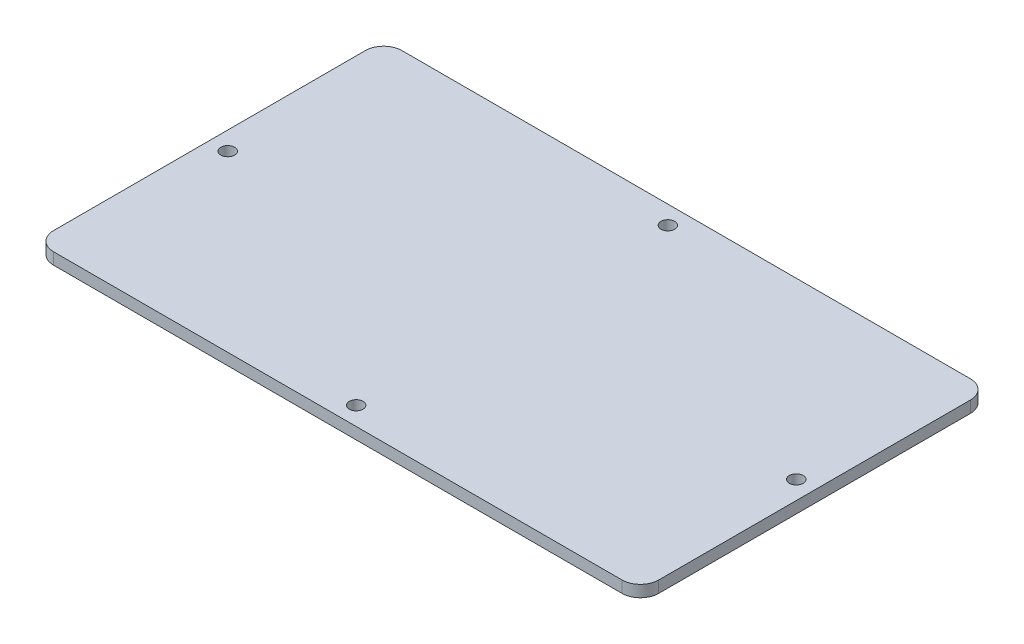
ISO-10303-21;
HEADER;
FILE_DESCRIPTION(('STEP AP214'),'2;1');
FILE_NAME('part.step','',(''),(''),'','','');
FILE_SCHEMA(('AUTOMOTIVE_DESIGN { 1 0 10303 214 1 1 1 1 }'));
ENDSEC;
DATA;
#1=APPLICATION_CONTEXT('core data for automotive mechanical design processes');
#2=APPLICATION_PROTOCOL_DEFINITION('international standard','automotive_design',2000,#1);
#3=PRODUCT_CONTEXT('',#1,'mechanical');
#4=PRODUCT('Part','Part','',(#3));
#5=PRODUCT_RELATED_PRODUCT_CATEGORY('part','',(#4));
#6=PRODUCT_DEFINITION_FORMATION('','',#4);
#7=PRODUCT_DEFINITION_CONTEXT('part definition',#1,'design');
#8=PRODUCT_DEFINITION('design','',#6,#7);
#9=PRODUCT_DEFINITION_SHAPE('','',#8);
#10=(LENGTH_UNIT() NAMED_UNIT(*) SI_UNIT(.MILLI.,.METRE.));
#11=(NAMED_UNIT(*) PLANE_ANGLE_UNIT() SI_UNIT($,.RADIAN.));
#12=(NAMED_UNIT(*) SI_UNIT($,.STERADIAN.) SOLID_ANGLE_UNIT());
#13=UNCERTAINTY_MEASURE_WITH_UNIT(LENGTH_MEASURE(1.E-05),#10,'distance_accuracy_value','');
#14=(GEOMETRIC_REPRESENTATION_CONTEXT(3) GLOBAL_UNCERTAINTY_ASSIGNED_CONTEXT((#13)) GLOBAL_UNIT_ASSIGNED_CONTEXT((#10,
#11,#12)) REPRESENTATION_CONTEXT('',''));
#15=CARTESIAN_POINT('',(0.,0.,0.));
#16=DIRECTION('',(0.,0.,1.));
#17=DIRECTION('',(1.,0.,0.));
#18=AXIS2_PLACEMENT_3D('',#15,#16,#17);
#19=CARTESIAN_POINT('',(-160.,3.175,-4.99999999999998));
#20=DIRECTION('',(0.,-1.,0.));
#21=DIRECTION('',(0.,0.,-1.));
#22=AXIS2_PLACEMENT_3D('',#19,#20,#21);
#23=PLANE('',#22);
#24=CARTESIAN_POINT('',(-160.,3.175,-4.99999999999998));
#25=DIRECTION('',(0.,1.,0.));
#26=DIRECTION('',(0.,0.,-1.));
#27=AXIS2_PLACEMENT_3D('',#24,#25,#26);
#28=CIRCLE('',#27,5.);
#29=CARTESIAN_POINT('',(-165.,3.175,-5.00000000000002));
#30=VERTEX_POINT('',#29);
#31=CARTESIAN_POINT('',(-160.,3.175,0.));
#32=VERTEX_POINT('',#31);
#33=EDGE_CURVE('E159',#30,#32,#28,.T.);
#34=ORIENTED_EDGE('',*,*,#33,.T.);
#35=DIRECTION('',(1.,0.,0.));
#36=VECTOR('',#35,1.);
#37=CARTESIAN_POINT('',(-5.00000000000004,3.175,0.));
#38=LINE('',#37,#36);
#39=CARTESIAN_POINT('',(-5.00000000000004,3.175,0.));
#40=VERTEX_POINT('',#39);
#41=EDGE_CURVE('E96',#32,#40,#38,.T.);
#42=ORIENTED_EDGE('',*,*,#41,.T.);
#43=CARTESIAN_POINT('',(-5.,3.175,-5.));
#44=DIRECTION('',(0.,1.,0.));
#45=DIRECTION('',(0.,0.,1.));
#46=AXIS2_PLACEMENT_3D('',#43,#44,#45);
#47=CIRCLE('',#46,5.);
#48=CARTESIAN_POINT('',(0.,3.175,-5.00000000000004));
#49=VERTEX_POINT('',#48);
#50=EDGE_CURVE('E170',#40,#49,#47,.T.);
#51=ORIENTED_EDGE('',*,*,#50,.T.);
#52=DIRECTION('',(0.,0.,-1.));
#53=VECTOR('',#52,1.);
#54=CARTESIAN_POINT('',(0.,3.175,-5.00000000000004));
#55=LINE('',#54,#53);
#56=CARTESIAN_POINT('',(0.,3.175,-90.));
#57=VERTEX_POINT('',#56);
#58=EDGE_CURVE('E173',#49,#57,#55,.T.);
#59=ORIENTED_EDGE('',*,*,#58,.T.);
#60=CARTESIAN_POINT('',(-5.,3.175,-90.));
#61=DIRECTION('',(0.,1.,0.));
#62=DIRECTION('',(0.,0.,1.));
#63=AXIS2_PLACEMENT_3D('',#60,#61,#62);
#64=CIRCLE('',#63,5.);
#65=CARTESIAN_POINT('',(-5.00000000000003,3.175,-95.));
#66=VERTEX_POINT('',#65);
#67=EDGE_CURVE('E115',#57,#66,#64,.T.);
#68=ORIENTED_EDGE('',*,*,#67,.T.);
#69=DIRECTION('',(-1.,0.,0.));
#70=VECTOR('',#69,1.);
#71=CARTESIAN_POINT('',(-5.00000000000004,3.175,-95.));
#72=LINE('',#71,#70);
#73=CARTESIAN_POINT('',(-160.,3.175,-95.));
#74=VERTEX_POINT('',#73);
#75=EDGE_CURVE('E109',#66,#74,#72,.T.);
#76=ORIENTED_EDGE('',*,*,#75,.T.);
#77=CARTESIAN_POINT('',(-160.,3.175,-90.));
#78=DIRECTION('',(0.,1.,0.));
#79=DIRECTION('',(0.,0.,1.));
#80=AXIS2_PLACEMENT_3D('',#77,#78,#79);
#81=CIRCLE('',#80,5.);
#82=CARTESIAN_POINT('',(-165.,3.175,-90.));
#83=VERTEX_POINT('',#82);
#84=EDGE_CURVE('E113',#74,#83,#81,.T.);
#85=ORIENTED_EDGE('',*,*,#84,.T.);
#86=DIRECTION('',(0.,0.,1.));
#87=VECTOR('',#86,1.);
#88=CARTESIAN_POINT('',(-165.,3.175,-5.00000000000002));
#89=LINE('',#88,#87);
#90=EDGE_CURVE('E53',#83,#30,#89,.T.);
#91=ORIENTED_EDGE('',*,*,#90,.T.);
#92=EDGE_LOOP('',(#34,#42,#51,#59,#68,#76,#85,#91));
#93=FACE_BOUND('',#92,.T.);
#94=CARTESIAN_POINT('',(-160.,3.175,-47.5));
#95=DIRECTION('',(0.,1.,0.));
#96=DIRECTION('',(0.,0.,1.));
#97=AXIS2_PLACEMENT_3D('',#94,#95,#96);
#98=CIRCLE('',#97,1.87499999999999);
#99=CARTESIAN_POINT('',(-160.,3.175,-45.625));
#100=VERTEX_POINT('',#99);
#101=EDGE_CURVE('E147',#100,#100,#98,.T.);
#102=ORIENTED_EDGE('',*,*,#101,.F.);
#103=EDGE_LOOP('',(#102));
#104=FACE_BOUND('',#103,.T.);
#105=CARTESIAN_POINT('',(-5.,3.175,-47.5));
#106=DIRECTION('',(0.,1.,0.));
#107=DIRECTION('',(0.,0.,1.));
#108=AXIS2_PLACEMENT_3D('',#105,#106,#107);
#109=CIRCLE('',#108,1.875);
#110=CARTESIAN_POINT('',(-5.,3.175,-45.625));
#111=VERTEX_POINT('',#110);
#112=EDGE_CURVE('E158',#111,#111,#109,.T.);
#113=ORIENTED_EDGE('',*,*,#112,.F.);
#114=EDGE_LOOP('',(#113));
#115=FACE_BOUND('',#114,.T.);
#116=CARTESIAN_POINT('',(-82.5,3.175,-90.));
#117=DIRECTION('',(0.,1.,0.));
#118=DIRECTION('',(0.,0.,1.));
#119=AXIS2_PLACEMENT_3D('',#116,#117,#118);
#120=CIRCLE('',#119,1.875);
#121=CARTESIAN_POINT('',(-82.5,3.175,-88.125));
#122=VERTEX_POINT('',#121);
#123=EDGE_CURVE('E239',#122,#122,#120,.T.);
#124=ORIENTED_EDGE('',*,*,#123,.F.);
#125=EDGE_LOOP('',(#124));
#126=FACE_BOUND('',#125,.T.);
#127=CARTESIAN_POINT('',(-82.5,3.175,-5.));
#128=DIRECTION('',(0.,1.,0.));
#129=DIRECTION('',(0.,0.,1.));
#130=AXIS2_PLACEMENT_3D('',#127,#128,#129);
#131=CIRCLE('',#130,1.875);
#132=CARTESIAN_POINT('',(-82.5,3.175,-3.125));
#133=VERTEX_POINT('',#132);
#134=EDGE_CURVE('E232',#133,#133,#131,.T.);
#135=ORIENTED_EDGE('',*,*,#134,.F.);
#136=EDGE_LOOP('',(#135));
#137=FACE_BOUND('',#136,.T.);
#138=ADVANCED_FACE('F36',(#93,#104,#115,#126,#137),#23,.F.);
#139=CARTESIAN_POINT('',(-160.,0.,-4.99999999999998));
#140=DIRECTION('',(0.,-1.,0.));
#141=DIRECTION('',(0.,0.,-1.));
#142=AXIS2_PLACEMENT_3D('',#139,#140,#141);
#143=PLANE('',#142);
#144=CARTESIAN_POINT('',(-82.5,0.,-90.));
#145=DIRECTION('',(0.,1.,0.));
#146=DIRECTION('',(0.,0.,1.));
#147=AXIS2_PLACEMENT_3D('',#144,#145,#146);
#148=CIRCLE('',#147,1.875);
#149=CARTESIAN_POINT('',(-82.5,0.,-88.125));
#150=VERTEX_POINT('',#149);
#151=EDGE_CURVE('E236',#150,#150,#148,.T.);
#152=ORIENTED_EDGE('',*,*,#151,.T.);
#153=EDGE_LOOP('',(#152));
#154=FACE_BOUND('',#153,.T.);
#155=CARTESIAN_POINT('',(-160.,0.,-47.5));
#156=DIRECTION('',(0.,1.,0.));
#157=DIRECTION('',(0.,0.,1.));
#158=AXIS2_PLACEMENT_3D('',#155,#156,#157);
#159=CIRCLE('',#158,1.87499999999999);
#160=CARTESIAN_POINT('',(-160.,0.,-45.625));
#161=VERTEX_POINT('',#160);
#162=EDGE_CURVE('E154',#161,#161,#159,.T.);
#163=ORIENTED_EDGE('',*,*,#162,.T.);
#164=EDGE_LOOP('',(#163));
#165=FACE_BOUND('',#164,.T.);
#166=CARTESIAN_POINT('',(-160.,0.,-4.99999999999998));
#167=DIRECTION('',(0.,1.,0.));
#168=DIRECTION('',(0.,0.,-1.));
#169=AXIS2_PLACEMENT_3D('',#166,#167,#168);
#170=CIRCLE('',#169,5.);
#171=CARTESIAN_POINT('',(-165.,0.,-5.00000000000002));
#172=VERTEX_POINT('',#171);
#173=CARTESIAN_POINT('',(-160.,0.,0.));
#174=VERTEX_POINT('',#173);
#175=EDGE_CURVE('E153',#172,#174,#170,.T.);
#176=ORIENTED_EDGE('',*,*,#175,.F.);
#177=DIRECTION('',(0.,0.,1.));
#178=VECTOR('',#177,1.);
#179=CARTESIAN_POINT('',(-165.,0.,-5.00000000000002));
#180=LINE('',#179,#178);
#181=CARTESIAN_POINT('',(-165.,0.,-90.));
#182=VERTEX_POINT('',#181);
#183=EDGE_CURVE('E88',#182,#172,#180,.T.);
#184=ORIENTED_EDGE('',*,*,#183,.F.);
#185=CARTESIAN_POINT('',(-160.,0.,-90.));
#186=DIRECTION('',(0.,1.,0.));
#187=DIRECTION('',(0.,0.,1.));
#188=AXIS2_PLACEMENT_3D('',#185,#186,#187);
#189=CIRCLE('',#188,5.);
#190=CARTESIAN_POINT('',(-160.,0.,-95.));
#191=VERTEX_POINT('',#190);
#192=EDGE_CURVE('E82',#191,#182,#189,.T.);
#193=ORIENTED_EDGE('',*,*,#192,.F.);
#194=DIRECTION('',(-1.,0.,0.));
#195=VECTOR('',#194,1.);
#196=CARTESIAN_POINT('',(-5.00000000000004,0.,-95.));
#197=LINE('',#196,#195);
#198=CARTESIAN_POINT('',(-5.00000000000003,0.,-95.));
#199=VERTEX_POINT('',#198);
#200=EDGE_CURVE('E124',#199,#191,#197,.T.);
#201=ORIENTED_EDGE('',*,*,#200,.F.);
#202=CARTESIAN_POINT('',(-5.,0.,-90.));
#203=DIRECTION('',(0.,1.,0.));
#204=DIRECTION('',(0.,0.,1.));
#205=AXIS2_PLACEMENT_3D('',#202,#203,#204);
#206=CIRCLE('',#205,5.);
#207=CARTESIAN_POINT('',(0.,0.,-90.));
#208=VERTEX_POINT('',#207);
#209=EDGE_CURVE('E205',#208,#199,#206,.T.);
#210=ORIENTED_EDGE('',*,*,#209,.F.);
#211=DIRECTION('',(0.,0.,-1.));
#212=VECTOR('',#211,1.);
#213=CARTESIAN_POINT('',(0.,0.,-5.00000000000004));
#214=LINE('',#213,#212);
#215=CARTESIAN_POINT('',(0.,0.,-5.00000000000004));
#216=VERTEX_POINT('',#215);
#217=EDGE_CURVE('E200',#216,#208,#214,.T.);
#218=ORIENTED_EDGE('',*,*,#217,.F.);
#219=CARTESIAN_POINT('',(-5.,0.,-5.));
#220=DIRECTION('',(0.,1.,0.));
#221=DIRECTION('',(0.,0.,1.));
#222=AXIS2_PLACEMENT_3D('',#219,#220,#221);
#223=CIRCLE('',#222,5.);
#224=CARTESIAN_POINT('',(-5.00000000000004,0.,0.));
#225=VERTEX_POINT('',#224);
#226=EDGE_CURVE('E192',#225,#216,#223,.T.);
#227=ORIENTED_EDGE('',*,*,#226,.F.);
#228=DIRECTION('',(1.,0.,0.));
#229=VECTOR('',#228,1.);
#230=CARTESIAN_POINT('',(-5.00000000000004,0.,0.));
#231=LINE('',#230,#229);
#232=EDGE_CURVE('E185',#174,#225,#231,.T.);
#233=ORIENTED_EDGE('',*,*,#232,.F.);
#234=EDGE_LOOP('',(#176,#184,#193,#201,#210,#218,#227,#233));
#235=FACE_BOUND('',#234,.T.);
#236=CARTESIAN_POINT('',(-5.,0.,-47.5));
#237=DIRECTION('',(0.,1.,0.));
#238=DIRECTION('',(0.,0.,1.));
#239=AXIS2_PLACEMENT_3D('',#236,#237,#238);
#240=CIRCLE('',#239,1.875);
#241=CARTESIAN_POINT('',(-5.,0.,-45.625));
#242=VERTEX_POINT('',#241);
#243=EDGE_CURVE('E155',#242,#242,#240,.T.);
#244=ORIENTED_EDGE('',*,*,#243,.T.);
#245=EDGE_LOOP('',(#244));
#246=FACE_BOUND('',#245,.T.);
#247=CARTESIAN_POINT('',(-82.5,0.,-5.));
#248=DIRECTION('',(0.,1.,0.));
#249=DIRECTION('',(0.,0.,1.));
#250=AXIS2_PLACEMENT_3D('',#247,#248,#249);
#251=CIRCLE('',#250,1.875);
#252=CARTESIAN_POINT('',(-82.5,0.,-3.125));
#253=VERTEX_POINT('',#252);
#254=EDGE_CURVE('E230',#253,#253,#251,.T.);
#255=ORIENTED_EDGE('',*,*,#254,.T.);
#256=EDGE_LOOP('',(#255));
#257=FACE_BOUND('',#256,.T.);
#258=ADVANCED_FACE('F220',(#154,#165,#235,#246,#257),#143,.T.);
#259=CARTESIAN_POINT('',(-160.,3.175,-4.99999999999998));
#260=DIRECTION('',(0.,-1.,0.));
#261=DIRECTION('',(0.,0.,-1.));
#262=AXIS2_PLACEMENT_3D('',#259,#260,#261);
#263=CYLINDRICAL_SURFACE('',#262,5.);
#264=ORIENTED_EDGE('',*,*,#175,.T.);
#265=DIRECTION('',(0.,-1.,0.));
#266=VECTOR('',#265,1.);
#267=CARTESIAN_POINT('',(-160.,3.175,0.));
#268=LINE('',#267,#266);
#269=EDGE_CURVE('E12',#32,#174,#268,.T.);
#270=ORIENTED_EDGE('',*,*,#269,.F.);
#271=ORIENTED_EDGE('',*,*,#33,.F.);
#272=DIRECTION('',(0.,-1.,0.));
#273=VECTOR('',#272,1.);
#274=CARTESIAN_POINT('',(-165.,3.175,-5.00000000000002));
#275=LINE('',#274,#273);
#276=EDGE_CURVE('E132',#30,#172,#275,.T.);
#277=ORIENTED_EDGE('',*,*,#276,.T.);
#278=EDGE_LOOP('',(#264,#270,#271,#277));
#279=FACE_BOUND('',#278,.T.);
#280=ADVANCED_FACE('F38',(#279),#263,.T.);
#281=CARTESIAN_POINT('',(-5.00000000000004,3.175,0.));
#282=DIRECTION('',(0.,0.,-1.));
#283=DIRECTION('',(-1.,0.,0.));
#284=AXIS2_PLACEMENT_3D('',#281,#282,#283);
#285=PLANE('',#284);
#286=ORIENTED_EDGE('',*,*,#232,.T.);
#287=DIRECTION('',(0.,-1.,0.));
#288=VECTOR('',#287,1.);
#289=CARTESIAN_POINT('',(-5.00000000000004,3.175,0.));
#290=LINE('',#289,#288);
#291=EDGE_CURVE('E45',#40,#225,#290,.T.);
#292=ORIENTED_EDGE('',*,*,#291,.F.);
#293=ORIENTED_EDGE('',*,*,#41,.F.);
#294=ORIENTED_EDGE('',*,*,#269,.T.);
#295=EDGE_LOOP('',(#286,#292,#293,#294));
#296=FACE_BOUND('',#295,.T.);
#297=ADVANCED_FACE('F184',(#296),#285,.F.);
#298=CARTESIAN_POINT('',(-5.,3.175,-5.));
#299=DIRECTION('',(0.,-1.,0.));
#300=DIRECTION('',(0.,0.,-1.));
#301=AXIS2_PLACEMENT_3D('',#298,#299,#300);
#302=CYLINDRICAL_SURFACE('',#301,5.);
#303=ORIENTED_EDGE('',*,*,#226,.T.);
#304=DIRECTION('',(0.,-1.,0.));
#305=VECTOR('',#304,1.);
#306=CARTESIAN_POINT('',(0.,3.175,-5.00000000000004));
#307=LINE('',#306,#305);
#308=EDGE_CURVE('E188',#49,#216,#307,.T.);
#309=ORIENTED_EDGE('',*,*,#308,.F.);
#310=ORIENTED_EDGE('',*,*,#50,.F.);
#311=ORIENTED_EDGE('',*,*,#291,.T.);
#312=EDGE_LOOP('',(#303,#309,#310,#311));
#313=FACE_BOUND('',#312,.T.);
#314=ADVANCED_FACE('F189',(#313),#302,.T.);
#315=CARTESIAN_POINT('',(0.,3.175,-5.00000000000004));
#316=DIRECTION('',(-1.,0.,0.));
#317=DIRECTION('',(0.,0.,1.));
#318=AXIS2_PLACEMENT_3D('',#315,#316,#317);
#319=PLANE('',#318);
#320=ORIENTED_EDGE('',*,*,#217,.T.);
#321=DIRECTION('',(0.,-1.,0.));
#322=VECTOR('',#321,1.);
#323=CARTESIAN_POINT('',(0.,3.175,-90.));
#324=LINE('',#323,#322);
#325=EDGE_CURVE('E195',#57,#208,#324,.T.);
#326=ORIENTED_EDGE('',*,*,#325,.F.);
#327=ORIENTED_EDGE('',*,*,#58,.F.);
#328=ORIENTED_EDGE('',*,*,#308,.T.);
#329=EDGE_LOOP('',(#320,#326,#327,#328));
#330=FACE_BOUND('',#329,.T.);
#331=ADVANCED_FACE('F198',(#330),#319,.F.);
#332=CARTESIAN_POINT('',(-5.,3.175,-90.));
#333=DIRECTION('',(0.,-1.,0.));
#334=DIRECTION('',(0.,0.,-1.));
#335=AXIS2_PLACEMENT_3D('',#332,#333,#334);
#336=CYLINDRICAL_SURFACE('',#335,5.);
#337=ORIENTED_EDGE('',*,*,#209,.T.);
#338=DIRECTION('',(0.,-1.,0.));
#339=VECTOR('',#338,1.);
#340=CARTESIAN_POINT('',(-5.00000000000003,3.175,-95.));
#341=LINE('',#340,#339);
#342=EDGE_CURVE('E125',#66,#199,#341,.T.);
#343=ORIENTED_EDGE('',*,*,#342,.F.);
#344=ORIENTED_EDGE('',*,*,#67,.F.);
#345=ORIENTED_EDGE('',*,*,#325,.T.);
#346=EDGE_LOOP('',(#337,#343,#344,#345));
#347=FACE_BOUND('',#346,.T.);
#348=ADVANCED_FACE('F204',(#347),#336,.T.);
#349=CARTESIAN_POINT('',(-5.00000000000004,3.175,-95.));
#350=DIRECTION('',(0.,0.,1.));
#351=DIRECTION('',(1.,0.,0.));
#352=AXIS2_PLACEMENT_3D('',#349,#350,#351);
#353=PLANE('',#352);
#354=ORIENTED_EDGE('',*,*,#200,.T.);
#355=DIRECTION('',(0.,-1.,0.));
#356=VECTOR('',#355,1.);
#357=CARTESIAN_POINT('',(-160.,3.175,-95.));
#358=LINE('',#357,#356);
#359=EDGE_CURVE('E121',#74,#191,#358,.T.);
#360=ORIENTED_EDGE('',*,*,#359,.F.);
#361=ORIENTED_EDGE('',*,*,#75,.F.);
#362=ORIENTED_EDGE('',*,*,#342,.T.);
#363=EDGE_LOOP('',(#354,#360,#361,#362));
#364=FACE_BOUND('',#363,.T.);
#365=ADVANCED_FACE('F122',(#364),#353,.F.);
#366=CARTESIAN_POINT('',(-160.,3.175,-90.));
#367=DIRECTION('',(0.,-1.,0.));
#368=DIRECTION('',(0.,0.,-1.));
#369=AXIS2_PLACEMENT_3D('',#366,#367,#368);
#370=CYLINDRICAL_SURFACE('',#369,5.);
#371=ORIENTED_EDGE('',*,*,#192,.T.);
#372=DIRECTION('',(0.,-1.,0.));
#373=VECTOR('',#372,1.);
#374=CARTESIAN_POINT('',(-165.,3.175,-90.));
#375=LINE('',#374,#373);
#376=EDGE_CURVE('E126',#83,#182,#375,.T.);
#377=ORIENTED_EDGE('',*,*,#376,.F.);
#378=ORIENTED_EDGE('',*,*,#84,.F.);
#379=ORIENTED_EDGE('',*,*,#359,.T.);
#380=EDGE_LOOP('',(#371,#377,#378,#379));
#381=FACE_BOUND('',#380,.T.);
#382=ADVANCED_FACE('F128',(#381),#370,.T.);
#383=CARTESIAN_POINT('',(-165.,3.175,-5.00000000000002));
#384=DIRECTION('',(1.,0.,0.));
#385=DIRECTION('',(0.,0.,-1.));
#386=AXIS2_PLACEMENT_3D('',#383,#384,#385);
#387=PLANE('',#386);
#388=ORIENTED_EDGE('',*,*,#183,.T.);
#389=ORIENTED_EDGE('',*,*,#276,.F.);
#390=ORIENTED_EDGE('',*,*,#90,.F.);
#391=ORIENTED_EDGE('',*,*,#376,.T.);
#392=EDGE_LOOP('',(#388,#389,#390,#391));
#393=FACE_BOUND('',#392,.T.);
#394=ADVANCED_FACE('F274',(#393),#387,.F.);
#395=CARTESIAN_POINT('',(-160.,3.175,-47.5));
#396=DIRECTION('',(0.,-1.,0.));
#397=DIRECTION('',(0.,0.,-1.));
#398=AXIS2_PLACEMENT_3D('',#395,#396,#397);
#399=CYLINDRICAL_SURFACE('',#398,1.87499999999999);
#400=ORIENTED_EDGE('',*,*,#101,.T.);
#401=EDGE_LOOP('',(#400));
#402=FACE_BOUND('',#401,.T.);
#403=ORIENTED_EDGE('',*,*,#162,.F.);
#404=EDGE_LOOP('',(#403));
#405=FACE_BOUND('',#404,.T.);
#406=ADVANCED_FACE('F272',(#402,#405),#399,.F.);
#407=CARTESIAN_POINT('',(-5.,3.175,-47.5));
#408=DIRECTION('',(0.,-1.,0.));
#409=DIRECTION('',(0.,0.,-1.));
#410=AXIS2_PLACEMENT_3D('',#407,#408,#409);
#411=CYLINDRICAL_SURFACE('',#410,1.875);
#412=ORIENTED_EDGE('',*,*,#112,.T.);
#413=EDGE_LOOP('',(#412));
#414=FACE_BOUND('',#413,.T.);
#415=ORIENTED_EDGE('',*,*,#243,.F.);
#416=EDGE_LOOP('',(#415));
#417=FACE_BOUND('',#416,.T.);
#418=ADVANCED_FACE('F250',(#414,#417),#411,.F.);
#419=CARTESIAN_POINT('',(-82.5,3.175,-90.));
#420=DIRECTION('',(0.,-1.,0.));
#421=DIRECTION('',(0.,0.,-1.));
#422=AXIS2_PLACEMENT_3D('',#419,#420,#421);
#423=CYLINDRICAL_SURFACE('',#422,1.875);
#424=ORIENTED_EDGE('',*,*,#123,.T.);
#425=EDGE_LOOP('',(#424));
#426=FACE_BOUND('',#425,.T.);
#427=ORIENTED_EDGE('',*,*,#151,.F.);
#428=EDGE_LOOP('',(#427));
#429=FACE_BOUND('',#428,.T.);
#430=ADVANCED_FACE('F262',(#426,#429),#423,.F.);
#431=CARTESIAN_POINT('',(-82.5,3.175,-5.));
#432=DIRECTION('',(0.,-1.,0.));
#433=DIRECTION('',(0.,0.,-1.));
#434=AXIS2_PLACEMENT_3D('',#431,#432,#433);
#435=CYLINDRICAL_SURFACE('',#434,1.875);
#436=ORIENTED_EDGE('',*,*,#134,.T.);
#437=EDGE_LOOP('',(#436));
#438=FACE_BOUND('',#437,.T.);
#439=ORIENTED_EDGE('',*,*,#254,.F.);
#440=EDGE_LOOP('',(#439));
#441=FACE_BOUND('',#440,.T.);
#442=ADVANCED_FACE('F260',(#438,#441),#435,.F.);
#443=CLOSED_SHELL('',(#138,#258,#280,#297,#314,#331,#348,#365,#382,#394,#406,#418,#430,#442));
#444=MANIFOLD_SOLID_BREP('B2',#443);
#445=ADVANCED_BREP_SHAPE_REPRESENTATION('',(#18,#444),#14);
#446=SHAPE_DEFINITION_REPRESENTATION(#9,#445);
ENDSEC;
END-ISO-10303-21;
